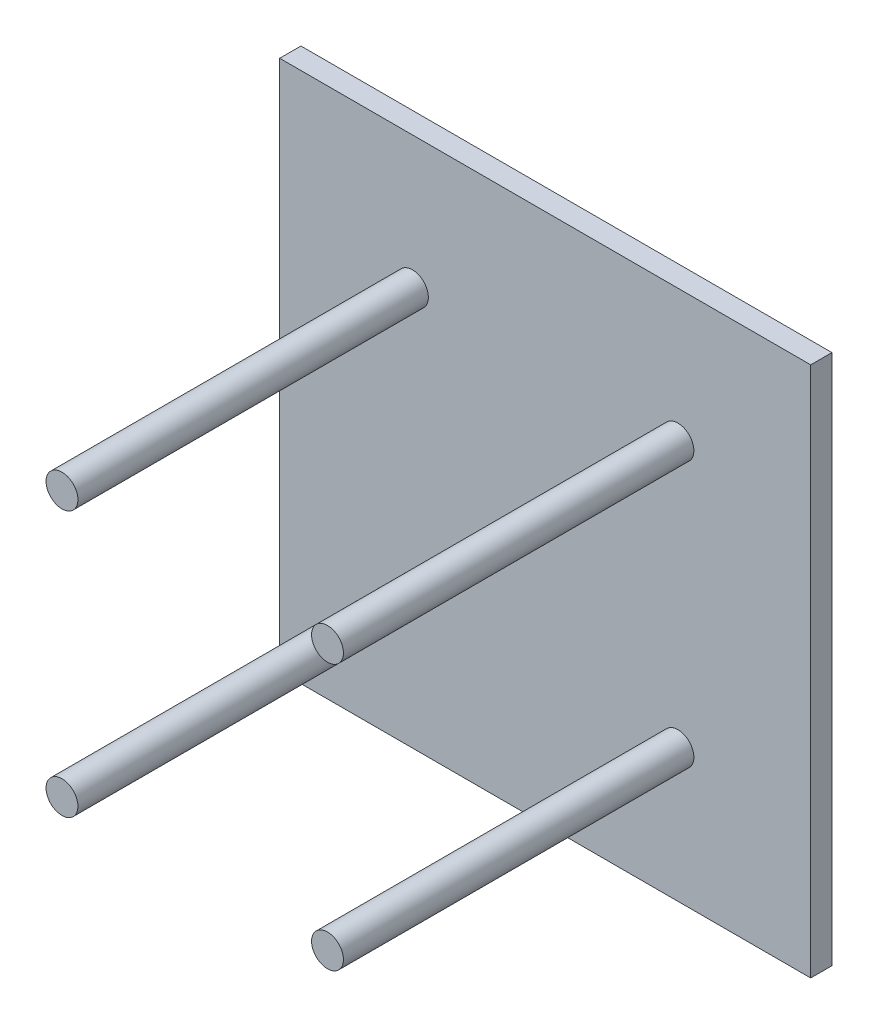
ISO-10303-21;
HEADER;
FILE_DESCRIPTION(('STEP AP214'),'2;1');
FILE_NAME('part.step','',(''),(''),'','','');
FILE_SCHEMA(('AUTOMOTIVE_DESIGN { 1 0 10303 214 1 1 1 1 }'));
ENDSEC;
DATA;
#1=APPLICATION_CONTEXT('core data for automotive mechanical design processes');
#2=APPLICATION_PROTOCOL_DEFINITION('international standard','automotive_design',2000,#1);
#3=PRODUCT_CONTEXT('',#1,'mechanical');
#4=PRODUCT('Part','Part','',(#3));
#5=PRODUCT_RELATED_PRODUCT_CATEGORY('part','',(#4));
#6=PRODUCT_DEFINITION_FORMATION('','',#4);
#7=PRODUCT_DEFINITION_CONTEXT('part definition',#1,'design');
#8=PRODUCT_DEFINITION('design','',#6,#7);
#9=PRODUCT_DEFINITION_SHAPE('','',#8);
#10=(LENGTH_UNIT() NAMED_UNIT(*) SI_UNIT(.MILLI.,.METRE.));
#11=(NAMED_UNIT(*) PLANE_ANGLE_UNIT() SI_UNIT($,.RADIAN.));
#12=(NAMED_UNIT(*) SI_UNIT($,.STERADIAN.) SOLID_ANGLE_UNIT());
#13=UNCERTAINTY_MEASURE_WITH_UNIT(LENGTH_MEASURE(1.E-05),#10,'distance_accuracy_value','');
#14=(GEOMETRIC_REPRESENTATION_CONTEXT(3) GLOBAL_UNCERTAINTY_ASSIGNED_CONTEXT((#13)) GLOBAL_UNIT_ASSIGNED_CONTEXT((#10,
#11,#12)) REPRESENTATION_CONTEXT('',''));
#15=CARTESIAN_POINT('',(0.,0.,0.));
#16=DIRECTION('',(0.,0.,1.));
#17=DIRECTION('',(1.,0.,0.));
#18=AXIS2_PLACEMENT_3D('',#15,#16,#17);
#19=CARTESIAN_POINT('',(500.,-500.,40.));
#20=DIRECTION('',(-1.,0.,0.));
#21=DIRECTION('',(0.,0.,1.));
#22=AXIS2_PLACEMENT_3D('',#19,#20,#21);
#23=PLANE('',#22);
#24=DIRECTION('',(0.,1.,0.));
#25=VECTOR('',#24,1.);
#26=CARTESIAN_POINT('',(500.,-500.,0.));
#27=LINE('',#26,#25);
#28=CARTESIAN_POINT('',(500.,-500.,0.));
#29=VERTEX_POINT('',#28);
#30=CARTESIAN_POINT('',(500.,500.,0.));
#31=VERTEX_POINT('',#30);
#32=EDGE_CURVE('E108',#29,#31,#27,.T.);
#33=ORIENTED_EDGE('',*,*,#32,.T.);
#34=DIRECTION('',(0.,0.,-1.));
#35=VECTOR('',#34,1.);
#36=CARTESIAN_POINT('',(500.,500.,40.));
#37=LINE('',#36,#35);
#38=CARTESIAN_POINT('',(500.,500.,40.));
#39=VERTEX_POINT('',#38);
#40=EDGE_CURVE('E44',#39,#31,#37,.T.);
#41=ORIENTED_EDGE('',*,*,#40,.F.);
#42=DIRECTION('',(0.,1.,0.));
#43=VECTOR('',#42,1.);
#44=CARTESIAN_POINT('',(500.,-500.,40.));
#45=LINE('',#44,#43);
#46=CARTESIAN_POINT('',(500.,-500.,40.));
#47=VERTEX_POINT('',#46);
#48=EDGE_CURVE('E95',#47,#39,#45,.T.);
#49=ORIENTED_EDGE('',*,*,#48,.F.);
#50=DIRECTION('',(0.,0.,-1.));
#51=VECTOR('',#50,1.);
#52=CARTESIAN_POINT('',(500.,-500.,40.));
#53=LINE('',#52,#51);
#54=EDGE_CURVE('E104',#47,#29,#53,.T.);
#55=ORIENTED_EDGE('',*,*,#54,.T.);
#56=EDGE_LOOP('',(#33,#41,#49,#55));
#57=FACE_BOUND('',#56,.T.);
#58=ADVANCED_FACE('F41',(#57),#23,.F.);
#59=CARTESIAN_POINT('',(-500.,500.,40.));
#60=DIRECTION('',(0.,-1.,0.));
#61=DIRECTION('',(0.,0.,-1.));
#62=AXIS2_PLACEMENT_3D('',#59,#60,#61);
#63=PLANE('',#62);
#64=DIRECTION('',(-1.,0.,0.));
#65=VECTOR('',#64,1.);
#66=CARTESIAN_POINT('',(-500.,500.,0.));
#67=LINE('',#66,#65);
#68=CARTESIAN_POINT('',(-500.,500.,0.));
#69=VERTEX_POINT('',#68);
#70=EDGE_CURVE('E100',#31,#69,#67,.T.);
#71=ORIENTED_EDGE('',*,*,#70,.T.);
#72=DIRECTION('',(0.,0.,-1.));
#73=VECTOR('',#72,1.);
#74=CARTESIAN_POINT('',(-500.,500.,40.));
#75=LINE('',#74,#73);
#76=CARTESIAN_POINT('',(-500.,500.,40.));
#77=VERTEX_POINT('',#76);
#78=EDGE_CURVE('E98',#77,#69,#75,.T.);
#79=ORIENTED_EDGE('',*,*,#78,.F.);
#80=DIRECTION('',(-1.,0.,0.));
#81=VECTOR('',#80,1.);
#82=CARTESIAN_POINT('',(-500.,500.,40.));
#83=LINE('',#82,#81);
#84=EDGE_CURVE('E90',#39,#77,#83,.T.);
#85=ORIENTED_EDGE('',*,*,#84,.F.);
#86=ORIENTED_EDGE('',*,*,#40,.T.);
#87=EDGE_LOOP('',(#71,#79,#85,#86));
#88=FACE_BOUND('',#87,.T.);
#89=ADVANCED_FACE('F99',(#88),#63,.F.);
#90=CARTESIAN_POINT('',(-500.,-500.,40.));
#91=DIRECTION('',(1.,0.,0.));
#92=DIRECTION('',(0.,0.,-1.));
#93=AXIS2_PLACEMENT_3D('',#90,#91,#92);
#94=PLANE('',#93);
#95=DIRECTION('',(0.,-1.,0.));
#96=VECTOR('',#95,1.);
#97=CARTESIAN_POINT('',(-500.,-500.,0.));
#98=LINE('',#97,#96);
#99=CARTESIAN_POINT('',(-500.,-500.,0.));
#100=VERTEX_POINT('',#99);
#101=EDGE_CURVE('E76',#69,#100,#98,.T.);
#102=ORIENTED_EDGE('',*,*,#101,.T.);
#103=DIRECTION('',(0.,0.,-1.));
#104=VECTOR('',#103,1.);
#105=CARTESIAN_POINT('',(-500.,-500.,40.));
#106=LINE('',#105,#104);
#107=CARTESIAN_POINT('',(-500.,-500.,40.));
#108=VERTEX_POINT('',#107);
#109=EDGE_CURVE('E101',#108,#100,#106,.T.);
#110=ORIENTED_EDGE('',*,*,#109,.F.);
#111=DIRECTION('',(0.,-1.,0.));
#112=VECTOR('',#111,1.);
#113=CARTESIAN_POINT('',(-500.,-500.,40.));
#114=LINE('',#113,#112);
#115=EDGE_CURVE('E93',#77,#108,#114,.T.);
#116=ORIENTED_EDGE('',*,*,#115,.F.);
#117=ORIENTED_EDGE('',*,*,#78,.T.);
#118=EDGE_LOOP('',(#102,#110,#116,#117));
#119=FACE_BOUND('',#118,.T.);
#120=ADVANCED_FACE('F102',(#119),#94,.F.);
#121=CARTESIAN_POINT('',(-500.,-500.,40.));
#122=DIRECTION('',(0.,1.,0.));
#123=DIRECTION('',(0.,0.,1.));
#124=AXIS2_PLACEMENT_3D('',#121,#122,#123);
#125=PLANE('',#124);
#126=DIRECTION('',(1.,0.,0.));
#127=VECTOR('',#126,1.);
#128=CARTESIAN_POINT('',(-500.,-500.,0.));
#129=LINE('',#128,#127);
#130=EDGE_CURVE('E82',#100,#29,#129,.T.);
#131=ORIENTED_EDGE('',*,*,#130,.T.);
#132=ORIENTED_EDGE('',*,*,#54,.F.);
#133=DIRECTION('',(1.,0.,0.));
#134=VECTOR('',#133,1.);
#135=CARTESIAN_POINT('',(-500.,-500.,40.));
#136=LINE('',#135,#134);
#137=EDGE_CURVE('E59',#108,#47,#136,.T.);
#138=ORIENTED_EDGE('',*,*,#137,.F.);
#139=ORIENTED_EDGE('',*,*,#109,.T.);
#140=EDGE_LOOP('',(#131,#132,#138,#139));
#141=FACE_BOUND('',#140,.T.);
#142=ADVANCED_FACE('F116',(#141),#125,.F.);
#143=CARTESIAN_POINT('',(0.,0.,40.));
#144=DIRECTION('',(0.,0.,-1.));
#145=DIRECTION('',(-1.,0.,0.));
#146=AXIS2_PLACEMENT_3D('',#143,#144,#145);
#147=PLANE('',#146);
#148=CARTESIAN_POINT('',(250.,250.,40.));
#149=DIRECTION('',(0.,0.,-1.));
#150=DIRECTION('',(-1.,0.,0.));
#151=AXIS2_PLACEMENT_3D('',#148,#149,#150);
#152=CIRCLE('',#151,30.0000000000001);
#153=CARTESIAN_POINT('',(220.,250.,40.));
#154=VERTEX_POINT('',#153);
#155=EDGE_CURVE('E11',#154,#154,#152,.F.);
#156=ORIENTED_EDGE('',*,*,#155,.F.);
#157=EDGE_LOOP('',(#156));
#158=FACE_BOUND('',#157,.T.);
#159=CARTESIAN_POINT('',(-250.,250.,40.));
#160=DIRECTION('',(0.,0.,-1.));
#161=DIRECTION('',(-1.,0.,0.));
#162=AXIS2_PLACEMENT_3D('',#159,#160,#161);
#163=CIRCLE('',#162,30.);
#164=CARTESIAN_POINT('',(-280.,250.,40.));
#165=VERTEX_POINT('',#164);
#166=EDGE_CURVE('E50',#165,#165,#163,.F.);
#167=ORIENTED_EDGE('',*,*,#166,.F.);
#168=EDGE_LOOP('',(#167));
#169=FACE_BOUND('',#168,.T.);
#170=CARTESIAN_POINT('',(250.,-250.,40.));
#171=DIRECTION('',(0.,0.,-1.));
#172=DIRECTION('',(-1.,0.,0.));
#173=AXIS2_PLACEMENT_3D('',#170,#171,#172);
#174=CIRCLE('',#173,30.);
#175=CARTESIAN_POINT('',(220.,-250.,40.));
#176=VERTEX_POINT('',#175);
#177=EDGE_CURVE('E125',#176,#176,#174,.F.);
#178=ORIENTED_EDGE('',*,*,#177,.F.);
#179=EDGE_LOOP('',(#178));
#180=FACE_BOUND('',#179,.T.);
#181=CARTESIAN_POINT('',(-250.,-250.,40.));
#182=DIRECTION('',(0.,0.,-1.));
#183=DIRECTION('',(-1.,0.,0.));
#184=AXIS2_PLACEMENT_3D('',#181,#182,#183);
#185=CIRCLE('',#184,30.);
#186=CARTESIAN_POINT('',(-280.,-250.,40.));
#187=VERTEX_POINT('',#186);
#188=EDGE_CURVE('E122',#187,#187,#185,.F.);
#189=ORIENTED_EDGE('',*,*,#188,.F.);
#190=EDGE_LOOP('',(#189));
#191=FACE_BOUND('',#190,.T.);
#192=ORIENTED_EDGE('',*,*,#48,.T.);
#193=ORIENTED_EDGE('',*,*,#84,.T.);
#194=ORIENTED_EDGE('',*,*,#115,.T.);
#195=ORIENTED_EDGE('',*,*,#137,.T.);
#196=EDGE_LOOP('',(#192,#193,#194,#195));
#197=FACE_BOUND('',#196,.T.);
#198=ADVANCED_FACE('F91',(#158,#169,#180,#191,#197),#147,.F.);
#199=CARTESIAN_POINT('',(0.,0.,0.));
#200=DIRECTION('',(0.,0.,-1.));
#201=DIRECTION('',(-1.,0.,0.));
#202=AXIS2_PLACEMENT_3D('',#199,#200,#201);
#203=PLANE('',#202);
#204=ORIENTED_EDGE('',*,*,#32,.F.);
#205=ORIENTED_EDGE('',*,*,#130,.F.);
#206=ORIENTED_EDGE('',*,*,#101,.F.);
#207=ORIENTED_EDGE('',*,*,#70,.F.);
#208=EDGE_LOOP('',(#204,#205,#206,#207));
#209=FACE_BOUND('',#208,.T.);
#210=ADVANCED_FACE('F119',(#209),#203,.T.);
#211=CARTESIAN_POINT('',(-250.,-250.,700.));
#212=DIRECTION('',(0.,0.,-1.));
#213=DIRECTION('',(-1.,0.,0.));
#214=AXIS2_PLACEMENT_3D('',#211,#212,#213);
#215=CYLINDRICAL_SURFACE('',#214,30.);
#216=CARTESIAN_POINT('',(-250.,-250.,700.));
#217=DIRECTION('',(0.,0.,1.));
#218=DIRECTION('',(1.,0.,0.));
#219=AXIS2_PLACEMENT_3D('',#216,#217,#218);
#220=CIRCLE('',#219,30.);
#221=CARTESIAN_POINT('',(-220.,-250.,700.));
#222=VERTEX_POINT('',#221);
#223=EDGE_CURVE('E111',#222,#222,#220,.T.);
#224=ORIENTED_EDGE('',*,*,#223,.F.);
#225=EDGE_LOOP('',(#224));
#226=FACE_BOUND('',#225,.T.);
#227=ORIENTED_EDGE('',*,*,#188,.T.);
#228=EDGE_LOOP('',(#227));
#229=FACE_BOUND('',#228,.T.);
#230=ADVANCED_FACE('F160',(#226,#229),#215,.T.);
#231=CARTESIAN_POINT('',(-250.,-250.,700.));
#232=DIRECTION('',(0.,0.,1.));
#233=DIRECTION('',(1.,0.,0.));
#234=AXIS2_PLACEMENT_3D('',#231,#232,#233);
#235=PLANE('',#234);
#236=ORIENTED_EDGE('',*,*,#223,.T.);
#237=EDGE_LOOP('',(#236));
#238=FACE_BOUND('',#237,.T.);
#239=ADVANCED_FACE('F162',(#238),#235,.T.);
#240=CARTESIAN_POINT('',(250.,-250.,700.));
#241=DIRECTION('',(0.,0.,-1.));
#242=DIRECTION('',(-1.,0.,0.));
#243=AXIS2_PLACEMENT_3D('',#240,#241,#242);
#244=CYLINDRICAL_SURFACE('',#243,30.);
#245=CARTESIAN_POINT('',(250.,-250.,700.));
#246=DIRECTION('',(0.,0.,1.));
#247=DIRECTION('',(1.,0.,0.));
#248=AXIS2_PLACEMENT_3D('',#245,#246,#247);
#249=CIRCLE('',#248,30.);
#250=CARTESIAN_POINT('',(280.,-250.,700.));
#251=VERTEX_POINT('',#250);
#252=EDGE_CURVE('E128',#251,#251,#249,.T.);
#253=ORIENTED_EDGE('',*,*,#252,.F.);
#254=EDGE_LOOP('',(#253));
#255=FACE_BOUND('',#254,.T.);
#256=ORIENTED_EDGE('',*,*,#177,.T.);
#257=EDGE_LOOP('',(#256));
#258=FACE_BOUND('',#257,.T.);
#259=ADVANCED_FACE('F169',(#255,#258),#244,.T.);
#260=CARTESIAN_POINT('',(250.,-250.,700.));
#261=DIRECTION('',(0.,0.,1.));
#262=DIRECTION('',(1.,0.,0.));
#263=AXIS2_PLACEMENT_3D('',#260,#261,#262);
#264=PLANE('',#263);
#265=ORIENTED_EDGE('',*,*,#252,.T.);
#266=EDGE_LOOP('',(#265));
#267=FACE_BOUND('',#266,.T.);
#268=ADVANCED_FACE('F228',(#267),#264,.T.);
#269=CARTESIAN_POINT('',(-250.,250.,700.));
#270=DIRECTION('',(0.,0.,-1.));
#271=DIRECTION('',(-1.,0.,0.));
#272=AXIS2_PLACEMENT_3D('',#269,#270,#271);
#273=CYLINDRICAL_SURFACE('',#272,30.);
#274=CARTESIAN_POINT('',(-250.,250.,700.));
#275=DIRECTION('',(0.,0.,1.));
#276=DIRECTION('',(1.,0.,0.));
#277=AXIS2_PLACEMENT_3D('',#274,#275,#276);
#278=CIRCLE('',#277,30.);
#279=CARTESIAN_POINT('',(-220.,250.,700.));
#280=VERTEX_POINT('',#279);
#281=EDGE_CURVE('E133',#280,#280,#278,.T.);
#282=ORIENTED_EDGE('',*,*,#281,.F.);
#283=EDGE_LOOP('',(#282));
#284=FACE_BOUND('',#283,.T.);
#285=ORIENTED_EDGE('',*,*,#166,.T.);
#286=EDGE_LOOP('',(#285));
#287=FACE_BOUND('',#286,.T.);
#288=ADVANCED_FACE('F237',(#284,#287),#273,.T.);
#289=CARTESIAN_POINT('',(-250.,250.,700.));
#290=DIRECTION('',(0.,0.,1.));
#291=DIRECTION('',(1.,0.,0.));
#292=AXIS2_PLACEMENT_3D('',#289,#290,#291);
#293=PLANE('',#292);
#294=ORIENTED_EDGE('',*,*,#281,.T.);
#295=EDGE_LOOP('',(#294));
#296=FACE_BOUND('',#295,.T.);
#297=ADVANCED_FACE('F147',(#296),#293,.T.);
#298=CARTESIAN_POINT('',(250.,250.,700.));
#299=DIRECTION('',(0.,0.,-1.));
#300=DIRECTION('',(-1.,0.,0.));
#301=AXIS2_PLACEMENT_3D('',#298,#299,#300);
#302=CYLINDRICAL_SURFACE('',#301,30.0000000000001);
#303=CARTESIAN_POINT('',(250.,250.,700.));
#304=DIRECTION('',(0.,0.,1.));
#305=DIRECTION('',(1.,0.,0.));
#306=AXIS2_PLACEMENT_3D('',#303,#304,#305);
#307=CIRCLE('',#306,30.0000000000001);
#308=CARTESIAN_POINT('',(280.,250.,700.));
#309=VERTEX_POINT('',#308);
#310=EDGE_CURVE('E137',#309,#309,#307,.T.);
#311=ORIENTED_EDGE('',*,*,#310,.F.);
#312=EDGE_LOOP('',(#311));
#313=FACE_BOUND('',#312,.T.);
#314=ORIENTED_EDGE('',*,*,#155,.T.);
#315=EDGE_LOOP('',(#314));
#316=FACE_BOUND('',#315,.T.);
#317=ADVANCED_FACE('F144',(#313,#316),#302,.T.);
#318=CARTESIAN_POINT('',(250.,250.,700.));
#319=DIRECTION('',(0.,0.,1.));
#320=DIRECTION('',(1.,0.,0.));
#321=AXIS2_PLACEMENT_3D('',#318,#319,#320);
#322=PLANE('',#321);
#323=ORIENTED_EDGE('',*,*,#310,.T.);
#324=EDGE_LOOP('',(#323));
#325=FACE_BOUND('',#324,.T.);
#326=ADVANCED_FACE('F142',(#325),#322,.T.);
#327=CLOSED_SHELL('',(#58,#89,#120,#142,#198,#210,#230,#239,#259,#268,#288,#297,#317,#326));
#328=MANIFOLD_SOLID_BREP('B2',#327);
#329=ADVANCED_BREP_SHAPE_REPRESENTATION('',(#18,#328),#14);
#330=SHAPE_DEFINITION_REPRESENTATION(#9,#329);
ENDSEC;
END-ISO-10303-21;
